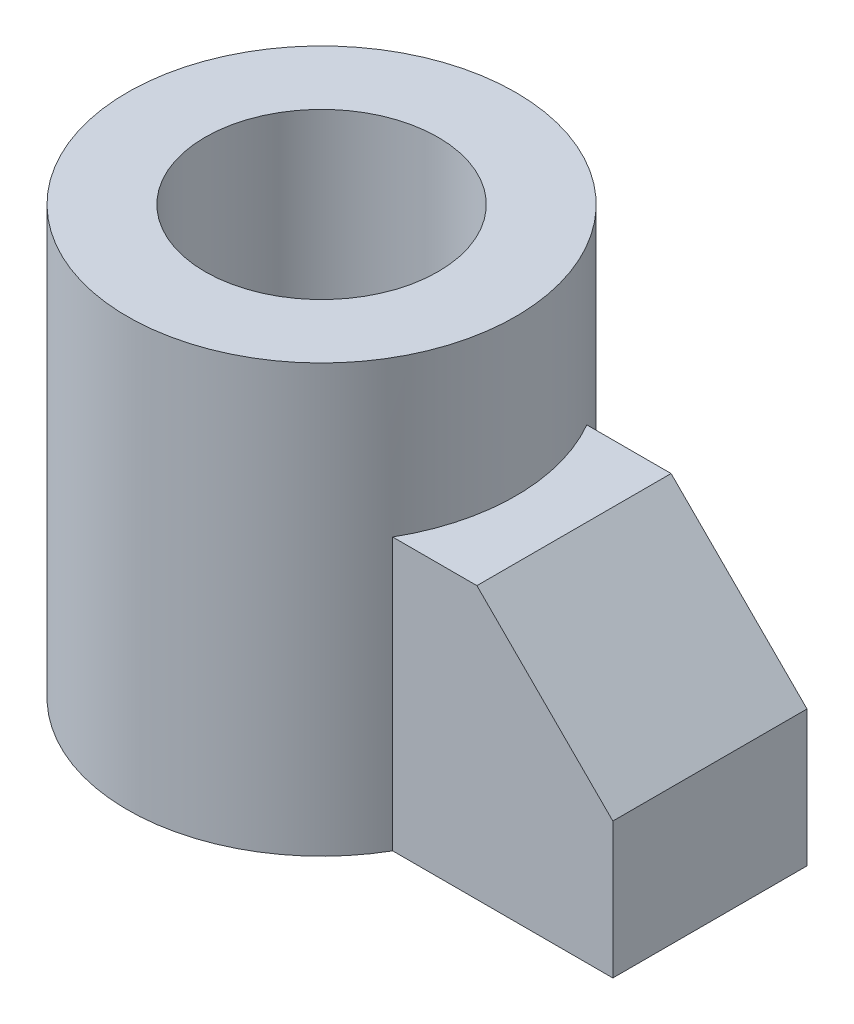
ISO-10303-21;
HEADER;
FILE_DESCRIPTION(('STEP AP214'),'2;1');
FILE_NAME('part.step','',(''),(''),'','','');
FILE_SCHEMA(('AUTOMOTIVE_DESIGN { 1 0 10303 214 1 1 1 1 }'));
ENDSEC;
DATA;
#1=APPLICATION_CONTEXT('core data for automotive mechanical design processes');
#2=APPLICATION_PROTOCOL_DEFINITION('international standard','automotive_design',2000,#1);
#3=PRODUCT_CONTEXT('',#1,'mechanical');
#4=PRODUCT('Part','Part','',(#3));
#5=PRODUCT_RELATED_PRODUCT_CATEGORY('part','',(#4));
#6=PRODUCT_DEFINITION_FORMATION('','',#4);
#7=PRODUCT_DEFINITION_CONTEXT('part definition',#1,'design');
#8=PRODUCT_DEFINITION('design','',#6,#7);
#9=PRODUCT_DEFINITION_SHAPE('','',#8);
#10=(LENGTH_UNIT() NAMED_UNIT(*) SI_UNIT(.MILLI.,.METRE.));
#11=(NAMED_UNIT(*) PLANE_ANGLE_UNIT() SI_UNIT($,.RADIAN.));
#12=(NAMED_UNIT(*) SI_UNIT($,.STERADIAN.) SOLID_ANGLE_UNIT());
#13=UNCERTAINTY_MEASURE_WITH_UNIT(LENGTH_MEASURE(1.E-05),#10,'distance_accuracy_value','');
#14=(GEOMETRIC_REPRESENTATION_CONTEXT(3) GLOBAL_UNCERTAINTY_ASSIGNED_CONTEXT((#13)) GLOBAL_UNIT_ASSIGNED_CONTEXT((#10,
#11,#12)) REPRESENTATION_CONTEXT('',''));
#15=CARTESIAN_POINT('',(0.,0.,0.));
#16=DIRECTION('',(0.,0.,1.));
#17=DIRECTION('',(1.,0.,0.));
#18=AXIS2_PLACEMENT_3D('',#15,#16,#17);
#19=CARTESIAN_POINT('',(0.,88.9,0.));
#20=DIRECTION('',(0.,0.,-1.));
#21=DIRECTION('',(-1.,0.,0.));
#22=AXIS2_PLACEMENT_3D('',#19,#20,#21);
#23=PLANE('',#22);
#24=DIRECTION('',(0.,-1.,0.));
#25=VECTOR('',#24,1.);
#26=CARTESIAN_POINT('',(127.,88.9,0.));
#27=LINE('',#26,#25);
#28=CARTESIAN_POINT('',(127.,44.45,0.));
#29=VERTEX_POINT('',#28);
#30=CARTESIAN_POINT('',(127.,0.,0.));
#31=VERTEX_POINT('',#30);
#32=EDGE_CURVE('E11',#29,#31,#27,.T.);
#33=ORIENTED_EDGE('',*,*,#32,.F.);
#34=DIRECTION('',(0.70710678118655,-0.707106781186546,0.));
#35=VECTOR('',#34,1.);
#36=CARTESIAN_POINT('',(82.5499999999998,88.9,0.));
#37=LINE('',#36,#35);
#38=CARTESIAN_POINT('',(82.5499999999998,88.9,0.));
#39=VERTEX_POINT('',#38);
#40=EDGE_CURVE('E86',#39,#29,#37,.T.);
#41=ORIENTED_EDGE('',*,*,#40,.F.);
#42=DIRECTION('',(1.,0.,0.));
#43=VECTOR('',#42,1.);
#44=CARTESIAN_POINT('',(0.,88.9,0.));
#45=LINE('',#44,#43);
#46=CARTESIAN_POINT('',(54.9926131403119,88.9,0.));
#47=VERTEX_POINT('',#46);
#48=EDGE_CURVE('E97',#47,#39,#45,.T.);
#49=ORIENTED_EDGE('',*,*,#48,.F.);
#50=DIRECTION('',(0.,-1.,0.));
#51=VECTOR('',#50,1.);
#52=CARTESIAN_POINT('',(54.9926131403119,139.7,0.));
#53=LINE('',#52,#51);
#54=CARTESIAN_POINT('',(54.9926131403119,0.,0.));
#55=VERTEX_POINT('',#54);
#56=EDGE_CURVE('E62',#47,#55,#53,.T.);
#57=ORIENTED_EDGE('',*,*,#56,.T.);
#58=DIRECTION('',(1.,0.,0.));
#59=VECTOR('',#58,1.);
#60=CARTESIAN_POINT('',(0.,0.,0.));
#61=LINE('',#60,#59);
#62=EDGE_CURVE('E117',#55,#31,#61,.T.);
#63=ORIENTED_EDGE('',*,*,#62,.T.);
#64=EDGE_LOOP('',(#33,#41,#49,#57,#63));
#65=FACE_BOUND('',#64,.T.);
#66=ADVANCED_FACE('F39',(#65),#23,.F.);
#67=CARTESIAN_POINT('',(127.,88.9,0.));
#68=DIRECTION('',(-1.,0.,0.));
#69=DIRECTION('',(0.,0.,1.));
#70=AXIS2_PLACEMENT_3D('',#67,#68,#69);
#71=PLANE('',#70);
#72=DIRECTION('',(0.,-1.,0.));
#73=VECTOR('',#72,1.);
#74=CARTESIAN_POINT('',(127.,88.9,-63.5));
#75=LINE('',#74,#73);
#76=CARTESIAN_POINT('',(127.,44.45,-63.5));
#77=VERTEX_POINT('',#76);
#78=CARTESIAN_POINT('',(127.,0.,-63.5));
#79=VERTEX_POINT('',#78);
#80=EDGE_CURVE('E47',#77,#79,#75,.T.);
#81=ORIENTED_EDGE('',*,*,#80,.F.);
#82=DIRECTION('',(0.,0.,1.));
#83=VECTOR('',#82,1.);
#84=CARTESIAN_POINT('',(127.,44.45,-95.251));
#85=LINE('',#84,#83);
#86=EDGE_CURVE('E92',#77,#29,#85,.T.);
#87=ORIENTED_EDGE('',*,*,#86,.T.);
#88=ORIENTED_EDGE('',*,*,#32,.T.);
#89=DIRECTION('',(0.,0.,-1.));
#90=VECTOR('',#89,1.);
#91=CARTESIAN_POINT('',(127.,0.,0.));
#92=LINE('',#91,#90);
#93=EDGE_CURVE('E112',#31,#79,#92,.T.);
#94=ORIENTED_EDGE('',*,*,#93,.T.);
#95=EDGE_LOOP('',(#81,#87,#88,#94));
#96=FACE_BOUND('',#95,.T.);
#97=ADVANCED_FACE('F130',(#96),#71,.F.);
#98=CARTESIAN_POINT('',(0.,88.9,-63.5));
#99=DIRECTION('',(0.,0.,1.));
#100=DIRECTION('',(1.,0.,0.));
#101=AXIS2_PLACEMENT_3D('',#98,#99,#100);
#102=PLANE('',#101);
#103=DIRECTION('',(-1.,0.,0.));
#104=VECTOR('',#103,1.);
#105=CARTESIAN_POINT('',(0.,88.9,-63.5));
#106=LINE('',#105,#104);
#107=CARTESIAN_POINT('',(82.5499999999998,88.9,-63.5));
#108=VERTEX_POINT('',#107);
#109=CARTESIAN_POINT('',(54.9926131403119,88.9,-63.5));
#110=VERTEX_POINT('',#109);
#111=EDGE_CURVE('E105',#108,#110,#106,.T.);
#112=ORIENTED_EDGE('',*,*,#111,.F.);
#113=DIRECTION('',(-0.70710678118655,0.707106781186546,0.));
#114=VECTOR('',#113,1.);
#115=CARTESIAN_POINT('',(82.5499999999998,88.9,-63.5));
#116=LINE('',#115,#114);
#117=EDGE_CURVE('E54',#77,#108,#116,.T.);
#118=ORIENTED_EDGE('',*,*,#117,.F.);
#119=ORIENTED_EDGE('',*,*,#80,.T.);
#120=DIRECTION('',(-1.,0.,0.));
#121=VECTOR('',#120,1.);
#122=CARTESIAN_POINT('',(0.,0.,-63.5));
#123=LINE('',#122,#121);
#124=CARTESIAN_POINT('',(54.9926131403119,0.,-63.5));
#125=VERTEX_POINT('',#124);
#126=EDGE_CURVE('E106',#79,#125,#123,.T.);
#127=ORIENTED_EDGE('',*,*,#126,.T.);
#128=DIRECTION('',(0.,-1.,0.));
#129=VECTOR('',#128,1.);
#130=CARTESIAN_POINT('',(54.9926131403119,139.7,-63.5));
#131=LINE('',#130,#129);
#132=EDGE_CURVE('E146',#125,#110,#131,.F.);
#133=ORIENTED_EDGE('',*,*,#132,.T.);
#134=EDGE_LOOP('',(#112,#118,#119,#127,#133));
#135=FACE_BOUND('',#134,.T.);
#136=ADVANCED_FACE('F125',(#135),#102,.F.);
#137=CARTESIAN_POINT('',(0.,88.9,0.));
#138=DIRECTION('',(0.,-1.,0.));
#139=DIRECTION('',(0.,0.,-1.));
#140=AXIS2_PLACEMENT_3D('',#137,#138,#139);
#141=PLANE('',#140);
#142=ORIENTED_EDGE('',*,*,#48,.T.);
#143=DIRECTION('',(0.,0.,1.));
#144=VECTOR('',#143,1.);
#145=CARTESIAN_POINT('',(82.5499999999998,88.9,-95.251));
#146=LINE('',#145,#144);
#147=EDGE_CURVE('E83',#108,#39,#146,.T.);
#148=ORIENTED_EDGE('',*,*,#147,.F.);
#149=ORIENTED_EDGE('',*,*,#111,.T.);
#150=CARTESIAN_POINT('',(0.,88.9,-31.75));
#151=DIRECTION('',(0.,-1.,0.));
#152=DIRECTION('',(0.,0.,-1.));
#153=AXIS2_PLACEMENT_3D('',#150,#151,#152);
#154=CIRCLE('',#153,63.5);
#155=EDGE_CURVE('E103',#110,#47,#154,.T.);
#156=ORIENTED_EDGE('',*,*,#155,.T.);
#157=EDGE_LOOP('',(#142,#148,#149,#156));
#158=FACE_BOUND('',#157,.T.);
#159=ADVANCED_FACE('F102',(#158),#141,.F.);
#160=CARTESIAN_POINT('',(0.,0.,0.));
#161=DIRECTION('',(0.,-1.,0.));
#162=DIRECTION('',(0.,0.,-1.));
#163=AXIS2_PLACEMENT_3D('',#160,#161,#162);
#164=PLANE('',#163);
#165=CARTESIAN_POINT('',(0.,0.,-31.75));
#166=DIRECTION('',(0.,-1.,0.));
#167=DIRECTION('',(0.,0.,-1.));
#168=AXIS2_PLACEMENT_3D('',#165,#166,#167);
#169=CIRCLE('',#168,38.1);
#170=CARTESIAN_POINT('',(0.,0.,-69.85));
#171=VERTEX_POINT('',#170);
#172=EDGE_CURVE('E213',#171,#171,#169,.F.);
#173=ORIENTED_EDGE('',*,*,#172,.T.);
#174=EDGE_LOOP('',(#173));
#175=FACE_BOUND('',#174,.T.);
#176=ORIENTED_EDGE('',*,*,#62,.F.);
#177=CARTESIAN_POINT('',(0.,0.,-31.75));
#178=DIRECTION('',(0.,-1.,0.));
#179=DIRECTION('',(0.,0.,-1.));
#180=AXIS2_PLACEMENT_3D('',#177,#178,#179);
#181=CIRCLE('',#180,63.5);
#182=EDGE_CURVE('E135',#55,#125,#181,.T.);
#183=ORIENTED_EDGE('',*,*,#182,.T.);
#184=ORIENTED_EDGE('',*,*,#126,.F.);
#185=ORIENTED_EDGE('',*,*,#93,.F.);
#186=EDGE_LOOP('',(#176,#183,#184,#185));
#187=FACE_BOUND('',#186,.T.);
#188=ADVANCED_FACE('F134',(#175,#187),#164,.T.);
#189=CARTESIAN_POINT('',(0.,139.7,-31.75));
#190=DIRECTION('',(0.,-1.,0.));
#191=DIRECTION('',(0.,0.,-1.));
#192=AXIS2_PLACEMENT_3D('',#189,#190,#191);
#193=CYLINDRICAL_SURFACE('',#192,63.5);
#194=CARTESIAN_POINT('',(0.,139.7,-31.75));
#195=DIRECTION('',(0.,-1.,0.));
#196=DIRECTION('',(0.,0.,-1.));
#197=AXIS2_PLACEMENT_3D('',#194,#195,#196);
#198=CIRCLE('',#197,63.5);
#199=CARTESIAN_POINT('',(0.,139.7,-95.25));
#200=VERTEX_POINT('',#199);
#201=EDGE_CURVE('E137',#200,#200,#198,.T.);
#202=ORIENTED_EDGE('',*,*,#201,.T.);
#203=EDGE_LOOP('',(#202));
#204=FACE_BOUND('',#203,.T.);
#205=ORIENTED_EDGE('',*,*,#56,.F.);
#206=ORIENTED_EDGE('',*,*,#155,.F.);
#207=ORIENTED_EDGE('',*,*,#132,.F.);
#208=ORIENTED_EDGE('',*,*,#182,.F.);
#209=EDGE_LOOP('',(#205,#206,#207,#208));
#210=FACE_BOUND('',#209,.T.);
#211=ADVANCED_FACE('F149',(#204,#210),#193,.T.);
#212=CARTESIAN_POINT('',(0.,139.7,-31.75));
#213=DIRECTION('',(0.,-1.,0.));
#214=DIRECTION('',(0.,0.,-1.));
#215=AXIS2_PLACEMENT_3D('',#212,#213,#214);
#216=PLANE('',#215);
#217=CARTESIAN_POINT('',(0.,139.7,-31.75));
#218=DIRECTION('',(0.,1.,0.));
#219=DIRECTION('',(0.,0.,1.));
#220=AXIS2_PLACEMENT_3D('',#217,#218,#219);
#221=CIRCLE('',#220,38.1);
#222=CARTESIAN_POINT('',(0.,139.7,6.35));
#223=VERTEX_POINT('',#222);
#224=EDGE_CURVE('E100',#223,#223,#221,.T.);
#225=ORIENTED_EDGE('',*,*,#224,.F.);
#226=EDGE_LOOP('',(#225));
#227=FACE_BOUND('',#226,.T.);
#228=ORIENTED_EDGE('',*,*,#201,.F.);
#229=EDGE_LOOP('',(#228));
#230=FACE_BOUND('',#229,.T.);
#231=ADVANCED_FACE('F151',(#227,#230),#216,.F.);
#232=CARTESIAN_POINT('',(82.5499999999998,88.9,-95.251));
#233=DIRECTION('',(-0.707106781186546,-0.70710678118655,0.));
#234=DIRECTION('',(0.70710678118655,-0.707106781186546,0.));
#235=AXIS2_PLACEMENT_3D('',#232,#233,#234);
#236=PLANE('',#235);
#237=ORIENTED_EDGE('',*,*,#117,.T.);
#238=ORIENTED_EDGE('',*,*,#147,.T.);
#239=ORIENTED_EDGE('',*,*,#40,.T.);
#240=ORIENTED_EDGE('',*,*,#86,.F.);
#241=EDGE_LOOP('',(#237,#238,#239,#240));
#242=FACE_BOUND('',#241,.T.);
#243=ADVANCED_FACE('F85',(#242),#236,.F.);
#244=CARTESIAN_POINT('',(0.,-0.001000000000001,-31.75));
#245=DIRECTION('',(0.,1.,0.));
#246=DIRECTION('',(0.,0.,1.));
#247=AXIS2_PLACEMENT_3D('',#244,#245,#246);
#248=CYLINDRICAL_SURFACE('',#247,38.1);
#249=ORIENTED_EDGE('',*,*,#172,.F.);
#250=EDGE_LOOP('',(#249));
#251=FACE_BOUND('',#250,.T.);
#252=ORIENTED_EDGE('',*,*,#224,.T.);
#253=EDGE_LOOP('',(#252));
#254=FACE_BOUND('',#253,.T.);
#255=ADVANCED_FACE('F197',(#251,#254),#248,.F.);
#256=CLOSED_SHELL('',(#66,#97,#136,#159,#188,#211,#231,#243,#255));
#257=MANIFOLD_SOLID_BREP('B2',#256);
#258=ADVANCED_BREP_SHAPE_REPRESENTATION('',(#18,#257),#14);
#259=SHAPE_DEFINITION_REPRESENTATION(#9,#258);
ENDSEC;
END-ISO-10303-21;
